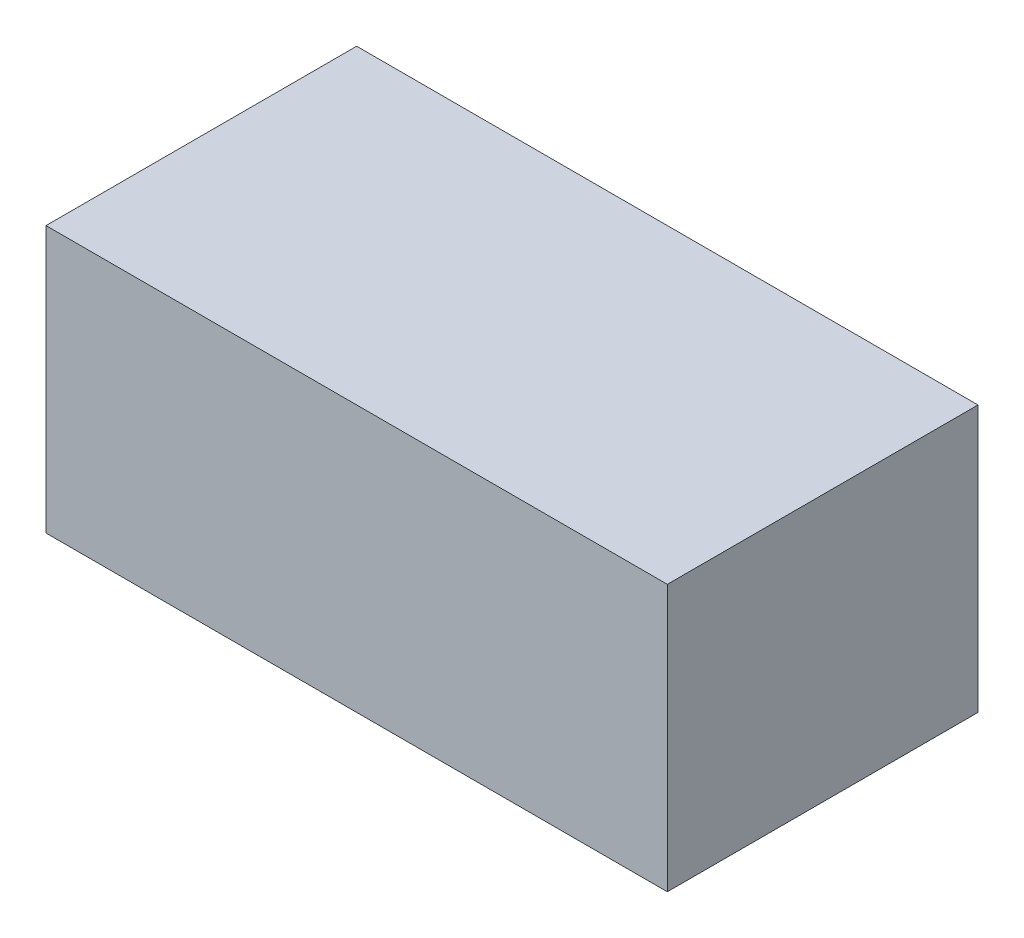
ISO-10303-21;
HEADER;
FILE_DESCRIPTION(('STEP AP214'),'2;1');
FILE_NAME('part.step','',(''),(''),'','','');
FILE_SCHEMA(('AUTOMOTIVE_DESIGN { 1 0 10303 214 1 1 1 1 }'));
ENDSEC;
DATA;
#1=APPLICATION_CONTEXT('core data for automotive mechanical design processes');
#2=APPLICATION_PROTOCOL_DEFINITION('international standard','automotive_design',2000,#1);
#3=PRODUCT_CONTEXT('',#1,'mechanical');
#4=PRODUCT('Part','Part','',(#3));
#5=PRODUCT_RELATED_PRODUCT_CATEGORY('part','',(#4));
#6=PRODUCT_DEFINITION_FORMATION('','',#4);
#7=PRODUCT_DEFINITION_CONTEXT('part definition',#1,'design');
#8=PRODUCT_DEFINITION('design','',#6,#7);
#9=PRODUCT_DEFINITION_SHAPE('','',#8);
#10=(LENGTH_UNIT() NAMED_UNIT(*) SI_UNIT(.MILLI.,.METRE.));
#11=(NAMED_UNIT(*) PLANE_ANGLE_UNIT() SI_UNIT($,.RADIAN.));
#12=(NAMED_UNIT(*) SI_UNIT($,.STERADIAN.) SOLID_ANGLE_UNIT());
#13=UNCERTAINTY_MEASURE_WITH_UNIT(LENGTH_MEASURE(1.E-05),#10,'distance_accuracy_value','');
#14=(GEOMETRIC_REPRESENTATION_CONTEXT(3) GLOBAL_UNCERTAINTY_ASSIGNED_CONTEXT((#13)) GLOBAL_UNIT_ASSIGNED_CONTEXT((#10,
#11,#12)) REPRESENTATION_CONTEXT('',''));
#15=CARTESIAN_POINT('',(0.,0.,0.));
#16=DIRECTION('',(0.,0.,1.));
#17=DIRECTION('',(1.,0.,0.));
#18=AXIS2_PLACEMENT_3D('',#15,#16,#17);
#19=CARTESIAN_POINT('',(70.,0.,0.));
#20=DIRECTION('',(0.,0.,-1.));
#21=DIRECTION('',(-1.,0.,0.));
#22=AXIS2_PLACEMENT_3D('',#19,#20,#21);
#23=PLANE('',#22);
#24=DIRECTION('',(0.,-1.,0.));
#25=VECTOR('',#24,1.);
#26=CARTESIAN_POINT('',(0.,0.,0.));
#27=LINE('',#26,#25);
#28=CARTESIAN_POINT('',(0.,30.,0.));
#29=VERTEX_POINT('',#28);
#30=CARTESIAN_POINT('',(0.,0.,0.));
#31=VERTEX_POINT('',#30);
#32=EDGE_CURVE('E97',#29,#31,#27,.T.);
#33=ORIENTED_EDGE('',*,*,#32,.T.);
#34=DIRECTION('',(-1.,0.,0.));
#35=VECTOR('',#34,1.);
#36=CARTESIAN_POINT('',(70.,0.,0.));
#37=LINE('',#36,#35);
#38=CARTESIAN_POINT('',(70.,0.,0.));
#39=VERTEX_POINT('',#38);
#40=EDGE_CURVE('E11',#39,#31,#37,.T.);
#41=ORIENTED_EDGE('',*,*,#40,.F.);
#42=DIRECTION('',(0.,-1.,0.));
#43=VECTOR('',#42,1.);
#44=CARTESIAN_POINT('',(70.,0.,0.));
#45=LINE('',#44,#43);
#46=CARTESIAN_POINT('',(70.,30.,0.));
#47=VERTEX_POINT('',#46);
#48=EDGE_CURVE('E85',#47,#39,#45,.T.);
#49=ORIENTED_EDGE('',*,*,#48,.F.);
#50=DIRECTION('',(-1.,0.,0.));
#51=VECTOR('',#50,1.);
#52=CARTESIAN_POINT('',(70.,30.,0.));
#53=LINE('',#52,#51);
#54=EDGE_CURVE('E93',#47,#29,#53,.T.);
#55=ORIENTED_EDGE('',*,*,#54,.T.);
#56=EDGE_LOOP('',(#33,#41,#49,#55));
#57=FACE_BOUND('',#56,.T.);
#58=ADVANCED_FACE('F34',(#57),#23,.F.);
#59=CARTESIAN_POINT('',(70.,0.,0.));
#60=DIRECTION('',(0.,1.,0.));
#61=DIRECTION('',(0.,0.,1.));
#62=AXIS2_PLACEMENT_3D('',#59,#60,#61);
#63=PLANE('',#62);
#64=DIRECTION('',(0.,0.,-1.));
#65=VECTOR('',#64,1.);
#66=CARTESIAN_POINT('',(0.,0.,0.));
#67=LINE('',#66,#65);
#68=CARTESIAN_POINT('',(0.,0.,-35.));
#69=VERTEX_POINT('',#68);
#70=EDGE_CURVE('E89',#31,#69,#67,.T.);
#71=ORIENTED_EDGE('',*,*,#70,.T.);
#72=DIRECTION('',(-1.,0.,0.));
#73=VECTOR('',#72,1.);
#74=CARTESIAN_POINT('',(70.,0.,-35.));
#75=LINE('',#74,#73);
#76=CARTESIAN_POINT('',(70.,0.,-35.));
#77=VERTEX_POINT('',#76);
#78=EDGE_CURVE('E42',#77,#69,#75,.T.);
#79=ORIENTED_EDGE('',*,*,#78,.F.);
#80=DIRECTION('',(0.,0.,-1.));
#81=VECTOR('',#80,1.);
#82=CARTESIAN_POINT('',(70.,0.,0.));
#83=LINE('',#82,#81);
#84=EDGE_CURVE('E80',#39,#77,#83,.T.);
#85=ORIENTED_EDGE('',*,*,#84,.F.);
#86=ORIENTED_EDGE('',*,*,#40,.T.);
#87=EDGE_LOOP('',(#71,#79,#85,#86));
#88=FACE_BOUND('',#87,.T.);
#89=ADVANCED_FACE('F88',(#88),#63,.F.);
#90=CARTESIAN_POINT('',(70.,0.,-35.));
#91=DIRECTION('',(0.,0.,1.));
#92=DIRECTION('',(1.,0.,0.));
#93=AXIS2_PLACEMENT_3D('',#90,#91,#92);
#94=PLANE('',#93);
#95=DIRECTION('',(0.,1.,0.));
#96=VECTOR('',#95,1.);
#97=CARTESIAN_POINT('',(0.,0.,-35.));
#98=LINE('',#97,#96);
#99=CARTESIAN_POINT('',(0.,30.,-35.));
#100=VERTEX_POINT('',#99);
#101=EDGE_CURVE('E67',#69,#100,#98,.T.);
#102=ORIENTED_EDGE('',*,*,#101,.T.);
#103=DIRECTION('',(-1.,0.,0.));
#104=VECTOR('',#103,1.);
#105=CARTESIAN_POINT('',(70.,30.,-35.));
#106=LINE('',#105,#104);
#107=CARTESIAN_POINT('',(70.,30.,-35.));
#108=VERTEX_POINT('',#107);
#109=EDGE_CURVE('E90',#108,#100,#106,.T.);
#110=ORIENTED_EDGE('',*,*,#109,.F.);
#111=DIRECTION('',(0.,1.,0.));
#112=VECTOR('',#111,1.);
#113=CARTESIAN_POINT('',(70.,0.,-35.));
#114=LINE('',#113,#112);
#115=EDGE_CURVE('E83',#77,#108,#114,.T.);
#116=ORIENTED_EDGE('',*,*,#115,.F.);
#117=ORIENTED_EDGE('',*,*,#78,.T.);
#118=EDGE_LOOP('',(#102,#110,#116,#117));
#119=FACE_BOUND('',#118,.T.);
#120=ADVANCED_FACE('F91',(#119),#94,.F.);
#121=CARTESIAN_POINT('',(70.,30.,0.));
#122=DIRECTION('',(0.,-1.,0.));
#123=DIRECTION('',(0.,0.,-1.));
#124=AXIS2_PLACEMENT_3D('',#121,#122,#123);
#125=PLANE('',#124);
#126=DIRECTION('',(0.,0.,1.));
#127=VECTOR('',#126,1.);
#128=CARTESIAN_POINT('',(0.,30.,0.));
#129=LINE('',#128,#127);
#130=EDGE_CURVE('E73',#100,#29,#129,.T.);
#131=ORIENTED_EDGE('',*,*,#130,.T.);
#132=ORIENTED_EDGE('',*,*,#54,.F.);
#133=DIRECTION('',(0.,0.,1.));
#134=VECTOR('',#133,1.);
#135=CARTESIAN_POINT('',(70.,30.,0.));
#136=LINE('',#135,#134);
#137=EDGE_CURVE('E50',#108,#47,#136,.T.);
#138=ORIENTED_EDGE('',*,*,#137,.F.);
#139=ORIENTED_EDGE('',*,*,#109,.T.);
#140=EDGE_LOOP('',(#131,#132,#138,#139));
#141=FACE_BOUND('',#140,.T.);
#142=ADVANCED_FACE('F104',(#141),#125,.F.);
#143=CARTESIAN_POINT('',(70.,0.,0.));
#144=DIRECTION('',(-1.,0.,0.));
#145=DIRECTION('',(0.,0.,1.));
#146=AXIS2_PLACEMENT_3D('',#143,#144,#145);
#147=PLANE('',#146);
#148=ORIENTED_EDGE('',*,*,#48,.T.);
#149=ORIENTED_EDGE('',*,*,#84,.T.);
#150=ORIENTED_EDGE('',*,*,#115,.T.);
#151=ORIENTED_EDGE('',*,*,#137,.T.);
#152=EDGE_LOOP('',(#148,#149,#150,#151));
#153=FACE_BOUND('',#152,.T.);
#154=ADVANCED_FACE('F81',(#153),#147,.F.);
#155=CARTESIAN_POINT('',(0.,0.,0.));
#156=DIRECTION('',(-1.,0.,0.));
#157=DIRECTION('',(0.,0.,1.));
#158=AXIS2_PLACEMENT_3D('',#155,#156,#157);
#159=PLANE('',#158);
#160=ORIENTED_EDGE('',*,*,#32,.F.);
#161=ORIENTED_EDGE('',*,*,#130,.F.);
#162=ORIENTED_EDGE('',*,*,#101,.F.);
#163=ORIENTED_EDGE('',*,*,#70,.F.);
#164=EDGE_LOOP('',(#160,#161,#162,#163));
#165=FACE_BOUND('',#164,.T.);
#166=ADVANCED_FACE('F107',(#165),#159,.T.);
#167=CLOSED_SHELL('',(#58,#89,#120,#142,#154,#166));
#168=MANIFOLD_SOLID_BREP('B2',#167);
#169=ADVANCED_BREP_SHAPE_REPRESENTATION('',(#18,#168),#14);
#170=SHAPE_DEFINITION_REPRESENTATION(#9,#169);
ENDSEC;
END-ISO-10303-21;
